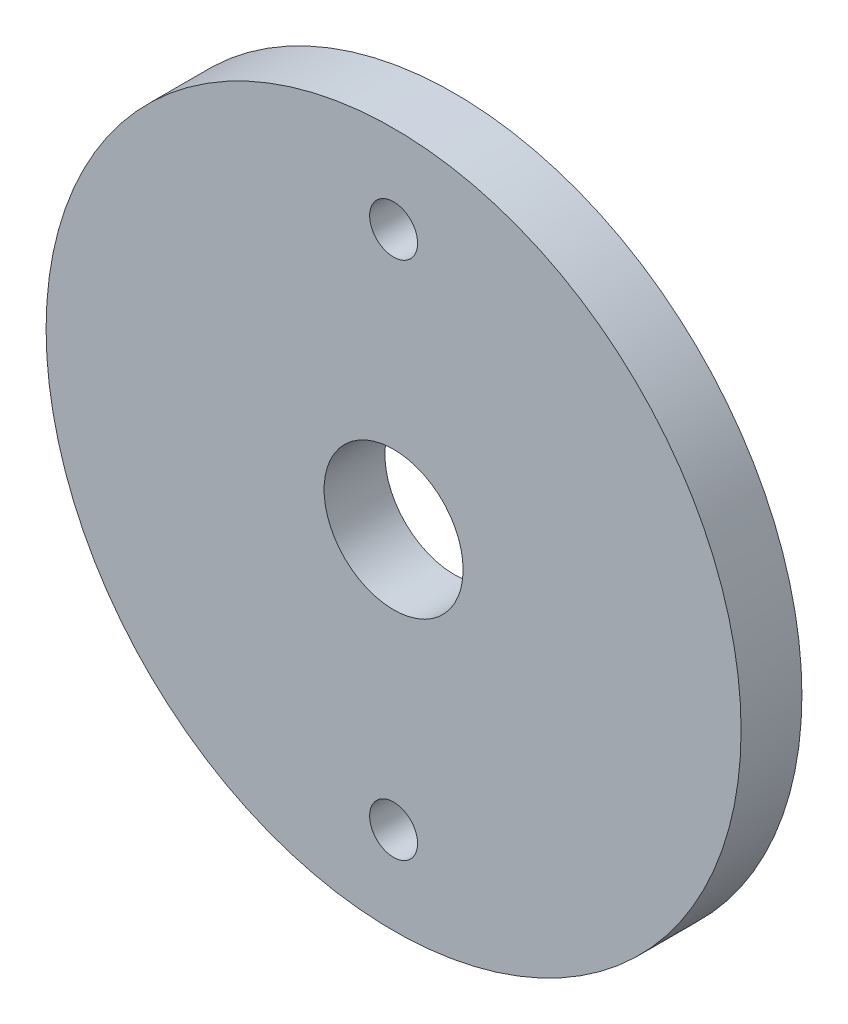
ISO-10303-21;
HEADER;
FILE_DESCRIPTION(('STEP AP214'),'2;1');
FILE_NAME('part.step','',(''),(''),'','','');
FILE_SCHEMA(('AUTOMOTIVE_DESIGN { 1 0 10303 214 1 1 1 1 }'));
ENDSEC;
DATA;
#1=APPLICATION_CONTEXT('core data for automotive mechanical design processes');
#2=APPLICATION_PROTOCOL_DEFINITION('international standard','automotive_design',2000,#1);
#3=PRODUCT_CONTEXT('',#1,'mechanical');
#4=PRODUCT('Part','Part','',(#3));
#5=PRODUCT_RELATED_PRODUCT_CATEGORY('part','',(#4));
#6=PRODUCT_DEFINITION_FORMATION('','',#4);
#7=PRODUCT_DEFINITION_CONTEXT('part definition',#1,'design');
#8=PRODUCT_DEFINITION('design','',#6,#7);
#9=PRODUCT_DEFINITION_SHAPE('','',#8);
#10=(LENGTH_UNIT() NAMED_UNIT(*) SI_UNIT(.MILLI.,.METRE.));
#11=(NAMED_UNIT(*) PLANE_ANGLE_UNIT() SI_UNIT($,.RADIAN.));
#12=(NAMED_UNIT(*) SI_UNIT($,.STERADIAN.) SOLID_ANGLE_UNIT());
#13=UNCERTAINTY_MEASURE_WITH_UNIT(LENGTH_MEASURE(1.E-05),#10,'distance_accuracy_value','');
#14=(GEOMETRIC_REPRESENTATION_CONTEXT(3) GLOBAL_UNCERTAINTY_ASSIGNED_CONTEXT((#13)) GLOBAL_UNIT_ASSIGNED_CONTEXT((#10,
#11,#12)) REPRESENTATION_CONTEXT('',''));
#15=CARTESIAN_POINT('',(0.,0.,0.));
#16=DIRECTION('',(0.,0.,1.));
#17=DIRECTION('',(1.,0.,0.));
#18=AXIS2_PLACEMENT_3D('',#15,#16,#17);
#19=CARTESIAN_POINT('',(0.,0.,4.445));
#20=DIRECTION('',(0.,0.,1.));
#21=DIRECTION('',(1.,0.,0.));
#22=AXIS2_PLACEMENT_3D('',#19,#20,#21);
#23=PLANE('',#22);
#24=CARTESIAN_POINT('',(0.,18.9992,4.445));
#25=DIRECTION('',(0.,0.,1.));
#26=DIRECTION('',(1.,0.,0.));
#27=AXIS2_PLACEMENT_3D('',#24,#25,#26);
#28=CIRCLE('',#27,1.7526);
#29=CARTESIAN_POINT('',(1.7526,18.9992,4.445));
#30=VERTEX_POINT('',#29);
#31=EDGE_CURVE('E49',#30,#30,#28,.T.);
#32=ORIENTED_EDGE('',*,*,#31,.F.);
#33=EDGE_LOOP('',(#32));
#34=FACE_BOUND('',#33,.T.);
#35=CARTESIAN_POINT('',(0.,0.,4.445));
#36=DIRECTION('',(0.,0.,1.));
#37=DIRECTION('',(1.,0.,0.));
#38=AXIS2_PLACEMENT_3D('',#35,#36,#37);
#39=CIRCLE('',#38,25.4);
#40=CARTESIAN_POINT('',(25.4,0.,4.445));
#41=VERTEX_POINT('',#40);
#42=EDGE_CURVE('E10',#41,#41,#39,.T.);
#43=ORIENTED_EDGE('',*,*,#42,.T.);
#44=EDGE_LOOP('',(#43));
#45=FACE_BOUND('',#44,.T.);
#46=CARTESIAN_POINT('',(0.,0.,4.445));
#47=DIRECTION('',(0.,0.,1.));
#48=DIRECTION('',(1.,0.,0.));
#49=AXIS2_PLACEMENT_3D('',#46,#47,#48);
#50=CIRCLE('',#49,5.08);
#51=CARTESIAN_POINT('',(5.08,0.,4.445));
#52=VERTEX_POINT('',#51);
#53=EDGE_CURVE('E44',#52,#52,#50,.T.);
#54=ORIENTED_EDGE('',*,*,#53,.F.);
#55=EDGE_LOOP('',(#54));
#56=FACE_BOUND('',#55,.T.);
#57=CARTESIAN_POINT('',(0.,-18.9992,4.445));
#58=DIRECTION('',(0.,0.,1.));
#59=DIRECTION('',(1.,0.,0.));
#60=AXIS2_PLACEMENT_3D('',#57,#58,#59);
#61=CIRCLE('',#60,1.7526);
#62=CARTESIAN_POINT('',(1.7526,-18.9992,4.445));
#63=VERTEX_POINT('',#62);
#64=EDGE_CURVE('E55',#63,#63,#61,.T.);
#65=ORIENTED_EDGE('',*,*,#64,.F.);
#66=EDGE_LOOP('',(#65));
#67=FACE_BOUND('',#66,.T.);
#68=ADVANCED_FACE('F33',(#34,#45,#56,#67),#23,.T.);
#69=CARTESIAN_POINT('',(0.,0.,0.));
#70=DIRECTION('',(0.,0.,1.));
#71=DIRECTION('',(1.,0.,0.));
#72=AXIS2_PLACEMENT_3D('',#69,#70,#71);
#73=PLANE('',#72);
#74=CARTESIAN_POINT('',(0.,18.9992,0.));
#75=DIRECTION('',(0.,0.,1.));
#76=DIRECTION('',(1.,0.,0.));
#77=AXIS2_PLACEMENT_3D('',#74,#75,#76);
#78=CIRCLE('',#77,1.7526);
#79=CARTESIAN_POINT('',(1.7526,18.9992,0.));
#80=VERTEX_POINT('',#79);
#81=EDGE_CURVE('E52',#80,#80,#78,.T.);
#82=ORIENTED_EDGE('',*,*,#81,.T.);
#83=EDGE_LOOP('',(#82));
#84=FACE_BOUND('',#83,.T.);
#85=CARTESIAN_POINT('',(0.,0.,0.));
#86=DIRECTION('',(0.,0.,1.));
#87=DIRECTION('',(1.,0.,0.));
#88=AXIS2_PLACEMENT_3D('',#85,#86,#87);
#89=CIRCLE('',#88,25.4);
#90=CARTESIAN_POINT('',(25.4,0.,0.));
#91=VERTEX_POINT('',#90);
#92=EDGE_CURVE('E37',#91,#91,#89,.T.);
#93=ORIENTED_EDGE('',*,*,#92,.F.);
#94=EDGE_LOOP('',(#93));
#95=FACE_BOUND('',#94,.T.);
#96=CARTESIAN_POINT('',(0.,0.,0.));
#97=DIRECTION('',(0.,0.,1.));
#98=DIRECTION('',(1.,0.,0.));
#99=AXIS2_PLACEMENT_3D('',#96,#97,#98);
#100=CIRCLE('',#99,5.08);
#101=CARTESIAN_POINT('',(5.08,0.,0.));
#102=VERTEX_POINT('',#101);
#103=EDGE_CURVE('E46',#102,#102,#100,.T.);
#104=ORIENTED_EDGE('',*,*,#103,.T.);
#105=EDGE_LOOP('',(#104));
#106=FACE_BOUND('',#105,.T.);
#107=CARTESIAN_POINT('',(0.,-18.9992,0.));
#108=DIRECTION('',(0.,0.,1.));
#109=DIRECTION('',(1.,0.,0.));
#110=AXIS2_PLACEMENT_3D('',#107,#108,#109);
#111=CIRCLE('',#110,1.7526);
#112=CARTESIAN_POINT('',(1.7526,-18.9992,0.));
#113=VERTEX_POINT('',#112);
#114=EDGE_CURVE('E58',#113,#113,#111,.T.);
#115=ORIENTED_EDGE('',*,*,#114,.T.);
#116=EDGE_LOOP('',(#115));
#117=FACE_BOUND('',#116,.T.);
#118=ADVANCED_FACE('F68',(#84,#95,#106,#117),#73,.F.);
#119=CARTESIAN_POINT('',(0.,0.,4.445));
#120=DIRECTION('',(0.,0.,-1.));
#121=DIRECTION('',(-1.,0.,0.));
#122=AXIS2_PLACEMENT_3D('',#119,#120,#121);
#123=CYLINDRICAL_SURFACE('',#122,25.4);
#124=ORIENTED_EDGE('',*,*,#42,.F.);
#125=EDGE_LOOP('',(#124));
#126=FACE_BOUND('',#125,.T.);
#127=ORIENTED_EDGE('',*,*,#92,.T.);
#128=EDGE_LOOP('',(#127));
#129=FACE_BOUND('',#128,.T.);
#130=ADVANCED_FACE('F35',(#126,#129),#123,.T.);
#131=CARTESIAN_POINT('',(0.,0.,4.445));
#132=DIRECTION('',(0.,0.,-1.));
#133=DIRECTION('',(-1.,0.,0.));
#134=AXIS2_PLACEMENT_3D('',#131,#132,#133);
#135=CYLINDRICAL_SURFACE('',#134,5.08);
#136=ORIENTED_EDGE('',*,*,#53,.T.);
#137=EDGE_LOOP('',(#136));
#138=FACE_BOUND('',#137,.T.);
#139=ORIENTED_EDGE('',*,*,#103,.F.);
#140=EDGE_LOOP('',(#139));
#141=FACE_BOUND('',#140,.T.);
#142=ADVANCED_FACE('F77',(#138,#141),#135,.F.);
#143=CARTESIAN_POINT('',(0.,18.9992,4.445));
#144=DIRECTION('',(0.,0.,-1.));
#145=DIRECTION('',(-1.,0.,0.));
#146=AXIS2_PLACEMENT_3D('',#143,#144,#145);
#147=CYLINDRICAL_SURFACE('',#146,1.7526);
#148=ORIENTED_EDGE('',*,*,#31,.T.);
#149=EDGE_LOOP('',(#148));
#150=FACE_BOUND('',#149,.T.);
#151=ORIENTED_EDGE('',*,*,#81,.F.);
#152=EDGE_LOOP('',(#151));
#153=FACE_BOUND('',#152,.T.);
#154=ADVANCED_FACE('F80',(#150,#153),#147,.F.);
#155=CARTESIAN_POINT('',(0.,-18.9992,4.445));
#156=DIRECTION('',(0.,0.,-1.));
#157=DIRECTION('',(-1.,0.,0.));
#158=AXIS2_PLACEMENT_3D('',#155,#156,#157);
#159=CYLINDRICAL_SURFACE('',#158,1.7526);
#160=ORIENTED_EDGE('',*,*,#64,.T.);
#161=EDGE_LOOP('',(#160));
#162=FACE_BOUND('',#161,.T.);
#163=ORIENTED_EDGE('',*,*,#114,.F.);
#164=EDGE_LOOP('',(#163));
#165=FACE_BOUND('',#164,.T.);
#166=ADVANCED_FACE('F64',(#162,#165),#159,.F.);
#167=CLOSED_SHELL('',(#68,#118,#130,#142,#154,#166));
#168=MANIFOLD_SOLID_BREP('B2',#167);
#169=ADVANCED_BREP_SHAPE_REPRESENTATION('',(#18,#168),#14);
#170=SHAPE_DEFINITION_REPRESENTATION(#9,#169);
ENDSEC;
END-ISO-10303-21;
